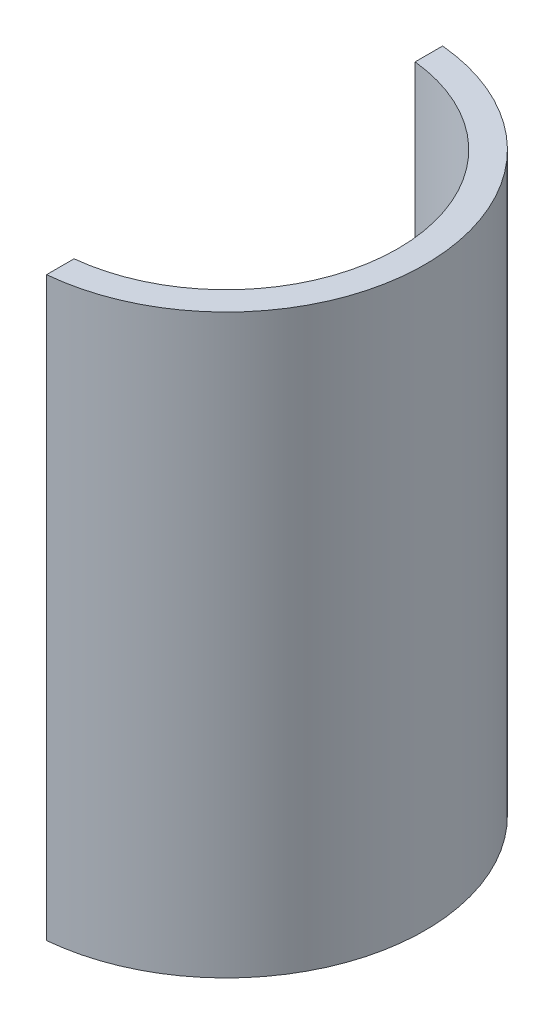
ISO-10303-21;
HEADER;
FILE_DESCRIPTION(('STEP AP214'),'2;1');
FILE_NAME('part.step','',(''),(''),'','','');
FILE_SCHEMA(('AUTOMOTIVE_DESIGN { 1 0 10303 214 1 1 1 1 }'));
ENDSEC;
DATA;
#1=APPLICATION_CONTEXT('core data for automotive mechanical design processes');
#2=APPLICATION_PROTOCOL_DEFINITION('international standard','automotive_design',2000,#1);
#3=PRODUCT_CONTEXT('',#1,'mechanical');
#4=PRODUCT('Part','Part','',(#3));
#5=PRODUCT_RELATED_PRODUCT_CATEGORY('part','',(#4));
#6=PRODUCT_DEFINITION_FORMATION('','',#4);
#7=PRODUCT_DEFINITION_CONTEXT('part definition',#1,'design');
#8=PRODUCT_DEFINITION('design','',#6,#7);
#9=PRODUCT_DEFINITION_SHAPE('','',#8);
#10=(LENGTH_UNIT() NAMED_UNIT(*) SI_UNIT(.MILLI.,.METRE.));
#11=(NAMED_UNIT(*) PLANE_ANGLE_UNIT() SI_UNIT($,.RADIAN.));
#12=(NAMED_UNIT(*) SI_UNIT($,.STERADIAN.) SOLID_ANGLE_UNIT());
#13=UNCERTAINTY_MEASURE_WITH_UNIT(LENGTH_MEASURE(1.E-05),#10,'distance_accuracy_value','');
#14=(GEOMETRIC_REPRESENTATION_CONTEXT(3) GLOBAL_UNCERTAINTY_ASSIGNED_CONTEXT((#13)) GLOBAL_UNIT_ASSIGNED_CONTEXT((#10,
#11,#12)) REPRESENTATION_CONTEXT('',''));
#15=CARTESIAN_POINT('',(0.,0.,0.));
#16=DIRECTION('',(0.,0.,1.));
#17=DIRECTION('',(1.,0.,0.));
#18=AXIS2_PLACEMENT_3D('',#15,#16,#17);
#19=CARTESIAN_POINT('',(0.,116.,0.));
#20=DIRECTION('',(0.,1.,0.));
#21=DIRECTION('',(0.,0.,1.));
#22=AXIS2_PLACEMENT_3D('',#19,#20,#21);
#23=PLANE('',#22);
#24=DIRECTION('',(0.,0.,-1.));
#25=VECTOR('',#24,1.);
#26=CARTESIAN_POINT('',(3.69620342660605,116.,-39.8288598911536));
#27=LINE('',#26,#25);
#28=CARTESIAN_POINT('',(3.69620342660606,116.,39.8288598911536));
#29=VERTEX_POINT('',#28);
#30=CARTESIAN_POINT('',(3.69620342660606,116.,34.3014297111526));
#31=VERTEX_POINT('',#30);
#32=EDGE_CURVE('E54',#29,#31,#27,.T.);
#33=ORIENTED_EDGE('',*,*,#32,.F.);
#34=CARTESIAN_POINT('',(0.,116.,0.));
#35=DIRECTION('',(0.,1.,0.));
#36=DIRECTION('',(0.,0.,1.));
#37=AXIS2_PLACEMENT_3D('',#34,#35,#36);
#38=CIRCLE('',#37,40.);
#39=CARTESIAN_POINT('',(3.69620342660605,116.,-39.8288598911536));
#40=VERTEX_POINT('',#39);
#41=EDGE_CURVE('E84',#29,#40,#38,.T.);
#42=ORIENTED_EDGE('',*,*,#41,.T.);
#43=CARTESIAN_POINT('',(3.69620342660605,116.,-34.3014297111526));
#44=VERTEX_POINT('',#43);
#45=EDGE_CURVE('E87',#44,#40,#27,.T.);
#46=ORIENTED_EDGE('',*,*,#45,.F.);
#47=CARTESIAN_POINT('',(0.,116.,0.));
#48=DIRECTION('',(0.,1.,0.));
#49=DIRECTION('',(0.,0.,1.));
#50=AXIS2_PLACEMENT_3D('',#47,#48,#49);
#51=CIRCLE('',#50,34.5);
#52=EDGE_CURVE('E86',#31,#44,#51,.T.);
#53=ORIENTED_EDGE('',*,*,#52,.F.);
#54=EDGE_LOOP('',(#33,#42,#46,#53));
#55=FACE_BOUND('',#54,.T.);
#56=ADVANCED_FACE('F32',(#55),#23,.T.);
#57=CARTESIAN_POINT('',(0.,0.,0.));
#58=DIRECTION('',(0.,1.,0.));
#59=DIRECTION('',(0.,0.,1.));
#60=AXIS2_PLACEMENT_3D('',#57,#58,#59);
#61=PLANE('',#60);
#62=CARTESIAN_POINT('',(0.,0.,0.));
#63=DIRECTION('',(0.,1.,0.));
#64=DIRECTION('',(0.,0.,1.));
#65=AXIS2_PLACEMENT_3D('',#62,#63,#64);
#66=CIRCLE('',#65,40.);
#67=CARTESIAN_POINT('',(3.69620342660606,0.,39.8288598911536));
#68=VERTEX_POINT('',#67);
#69=CARTESIAN_POINT('',(3.69620342660605,0.,-39.8288598911536));
#70=VERTEX_POINT('',#69);
#71=EDGE_CURVE('E90',#68,#70,#66,.T.);
#72=ORIENTED_EDGE('',*,*,#71,.F.);
#73=DIRECTION('',(0.,0.,-1.));
#74=VECTOR('',#73,1.);
#75=CARTESIAN_POINT('',(3.69620342660606,0.,0.));
#76=LINE('',#75,#74);
#77=CARTESIAN_POINT('',(3.69620342660606,0.,34.3014297111526));
#78=VERTEX_POINT('',#77);
#79=EDGE_CURVE('E73',#68,#78,#76,.T.);
#80=ORIENTED_EDGE('',*,*,#79,.T.);
#81=CARTESIAN_POINT('',(0.,0.,0.));
#82=DIRECTION('',(0.,1.,0.));
#83=DIRECTION('',(0.,0.,1.));
#84=AXIS2_PLACEMENT_3D('',#81,#82,#83);
#85=CIRCLE('',#84,34.5);
#86=CARTESIAN_POINT('',(3.69620342660605,0.,-34.3014297111526));
#87=VERTEX_POINT('',#86);
#88=EDGE_CURVE('E94',#78,#87,#85,.T.);
#89=ORIENTED_EDGE('',*,*,#88,.T.);
#90=EDGE_CURVE('E47',#87,#70,#76,.T.);
#91=ORIENTED_EDGE('',*,*,#90,.T.);
#92=EDGE_LOOP('',(#72,#80,#89,#91));
#93=FACE_BOUND('',#92,.T.);
#94=ADVANCED_FACE('F101',(#93),#61,.F.);
#95=CARTESIAN_POINT('',(0.,116.,0.));
#96=DIRECTION('',(0.,-1.,0.));
#97=DIRECTION('',(0.,0.,-1.));
#98=AXIS2_PLACEMENT_3D('',#95,#96,#97);
#99=CYLINDRICAL_SURFACE('',#98,40.);
#100=ORIENTED_EDGE('',*,*,#41,.F.);
#101=DIRECTION('',(0.,1.,0.));
#102=VECTOR('',#101,1.);
#103=CARTESIAN_POINT('',(3.69620342660606,-6.99999999999999,39.8288598911536));
#104=LINE('',#103,#102);
#105=EDGE_CURVE('E70',#68,#29,#104,.T.);
#106=ORIENTED_EDGE('',*,*,#105,.F.);
#107=ORIENTED_EDGE('',*,*,#71,.T.);
#108=DIRECTION('',(0.,1.,0.));
#109=VECTOR('',#108,1.);
#110=CARTESIAN_POINT('',(3.69620342660605,-6.99999999999999,-39.8288598911536));
#111=LINE('',#110,#109);
#112=EDGE_CURVE('E78',#70,#40,#111,.T.);
#113=ORIENTED_EDGE('',*,*,#112,.T.);
#114=EDGE_LOOP('',(#100,#106,#107,#113));
#115=FACE_BOUND('',#114,.T.);
#116=ADVANCED_FACE('F34',(#115),#99,.T.);
#117=CARTESIAN_POINT('',(0.,116.,0.));
#118=DIRECTION('',(0.,-1.,0.));
#119=DIRECTION('',(0.,0.,-1.));
#120=AXIS2_PLACEMENT_3D('',#117,#118,#119);
#121=CYLINDRICAL_SURFACE('',#120,34.5);
#122=DIRECTION('',(0.,-1.,0.));
#123=VECTOR('',#122,1.);
#124=CARTESIAN_POINT('',(3.69620342660606,116.,34.3014297111526));
#125=LINE('',#124,#123);
#126=EDGE_CURVE('E11',#31,#78,#125,.T.);
#127=ORIENTED_EDGE('',*,*,#126,.F.);
#128=ORIENTED_EDGE('',*,*,#52,.T.);
#129=DIRECTION('',(0.,-1.,0.));
#130=VECTOR('',#129,1.);
#131=CARTESIAN_POINT('',(3.69620342660605,116.,-34.3014297111526));
#132=LINE('',#131,#130);
#133=EDGE_CURVE('E40',#87,#44,#132,.F.);
#134=ORIENTED_EDGE('',*,*,#133,.F.);
#135=ORIENTED_EDGE('',*,*,#88,.F.);
#136=EDGE_LOOP('',(#127,#128,#134,#135));
#137=FACE_BOUND('',#136,.T.);
#138=ADVANCED_FACE('F103',(#137),#121,.F.);
#139=CARTESIAN_POINT('',(3.69620342660605,-6.99999999999999,-39.8288598911536));
#140=DIRECTION('',(1.,0.,0.));
#141=DIRECTION('',(0.,0.,-1.));
#142=AXIS2_PLACEMENT_3D('',#139,#140,#141);
#143=PLANE('',#142);
#144=ORIENTED_EDGE('',*,*,#133,.T.);
#145=ORIENTED_EDGE('',*,*,#45,.T.);
#146=ORIENTED_EDGE('',*,*,#112,.F.);
#147=ORIENTED_EDGE('',*,*,#90,.F.);
#148=EDGE_LOOP('',(#144,#145,#146,#147));
#149=FACE_BOUND('',#148,.T.);
#150=ADVANCED_FACE('F104',(#149),#143,.F.);
#151=ORIENTED_EDGE('',*,*,#105,.T.);
#152=ORIENTED_EDGE('',*,*,#32,.T.);
#153=ORIENTED_EDGE('',*,*,#126,.T.);
#154=ORIENTED_EDGE('',*,*,#79,.F.);
#155=EDGE_LOOP('',(#151,#152,#153,#154));
#156=FACE_BOUND('',#155,.T.);
#157=ADVANCED_FACE('F71',(#156),#143,.F.);
#158=CLOSED_SHELL('',(#56,#94,#116,#138,#150,#157));
#159=MANIFOLD_SOLID_BREP('B2',#158);
#160=ADVANCED_BREP_SHAPE_REPRESENTATION('',(#18,#159),#14);
#161=SHAPE_DEFINITION_REPRESENTATION(#9,#160);
ENDSEC;
END-ISO-10303-21;
